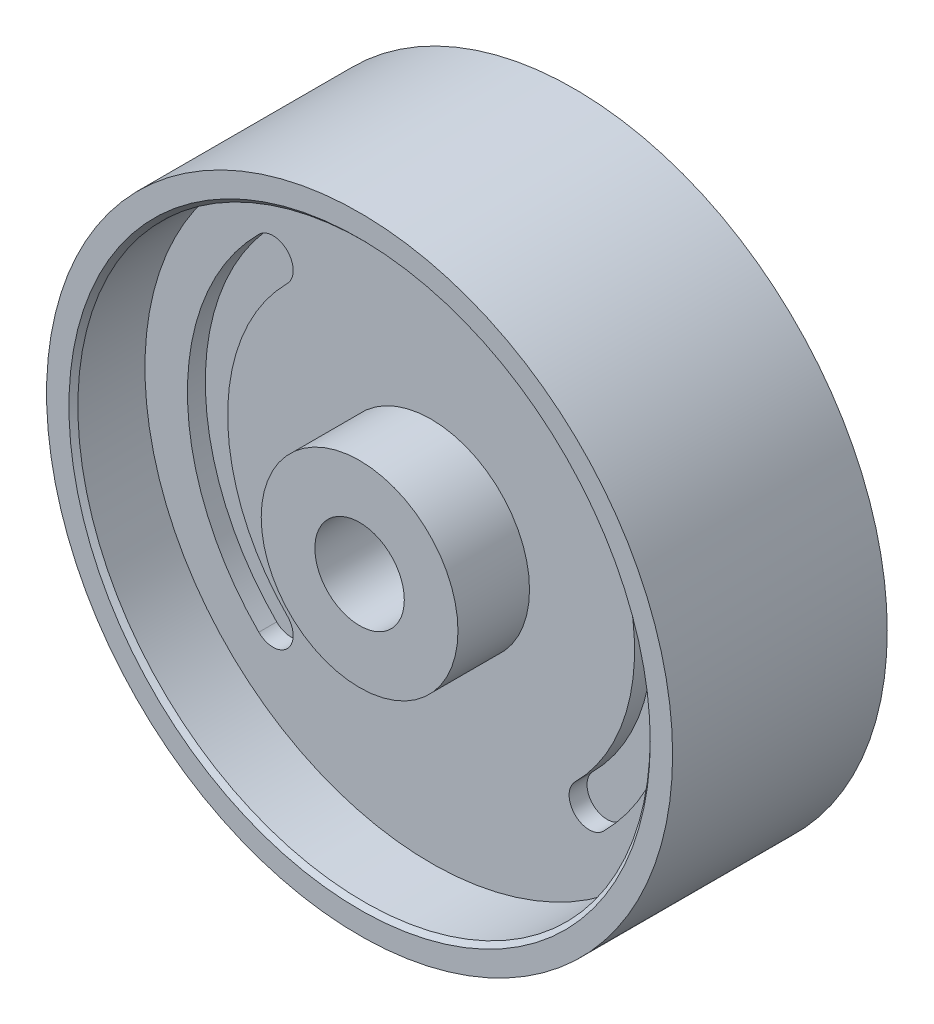
ISO-10303-21;
HEADER;
FILE_DESCRIPTION(('STEP AP214'),'2;1');
FILE_NAME('part.step','',(''),(''),'','','');
FILE_SCHEMA(('AUTOMOTIVE_DESIGN { 1 0 10303 214 1 1 1 1 }'));
ENDSEC;
DATA;
#1=APPLICATION_CONTEXT('core data for automotive mechanical design processes');
#2=APPLICATION_PROTOCOL_DEFINITION('international standard','automotive_design',2000,#1);
#3=PRODUCT_CONTEXT('',#1,'mechanical');
#4=PRODUCT('Part','Part','',(#3));
#5=PRODUCT_RELATED_PRODUCT_CATEGORY('part','',(#4));
#6=PRODUCT_DEFINITION_FORMATION('','',#4);
#7=PRODUCT_DEFINITION_CONTEXT('part definition',#1,'design');
#8=PRODUCT_DEFINITION('design','',#6,#7);
#9=PRODUCT_DEFINITION_SHAPE('','',#8);
#10=(LENGTH_UNIT() NAMED_UNIT(*) SI_UNIT(.MILLI.,.METRE.));
#11=(NAMED_UNIT(*) PLANE_ANGLE_UNIT() SI_UNIT($,.RADIAN.));
#12=(NAMED_UNIT(*) SI_UNIT($,.STERADIAN.) SOLID_ANGLE_UNIT());
#13=UNCERTAINTY_MEASURE_WITH_UNIT(LENGTH_MEASURE(1.E-05),#10,'distance_accuracy_value','');
#14=(GEOMETRIC_REPRESENTATION_CONTEXT(3) GLOBAL_UNCERTAINTY_ASSIGNED_CONTEXT((#13)) GLOBAL_UNIT_ASSIGNED_CONTEXT((#10,
#11,#12)) REPRESENTATION_CONTEXT('',''));
#15=CARTESIAN_POINT('',(0.,0.,0.));
#16=DIRECTION('',(0.,0.,1.));
#17=DIRECTION('',(1.,0.,0.));
#18=AXIS2_PLACEMENT_3D('',#15,#16,#17);
#19=CARTESIAN_POINT('',(0.,0.,-12.));
#20=DIRECTION('',(0.,0.,1.));
#21=DIRECTION('',(1.,0.,0.));
#22=AXIS2_PLACEMENT_3D('',#19,#20,#21);
#23=PLANE('',#22);
#24=CARTESIAN_POINT('',(0.,0.,-12.));
#25=DIRECTION('',(0.,0.,1.));
#26=DIRECTION('',(1.,0.,0.));
#27=AXIS2_PLACEMENT_3D('',#24,#25,#26);
#28=CIRCLE('',#27,5.);
#29=CARTESIAN_POINT('',(5.,0.,-12.));
#30=VERTEX_POINT('',#29);
#31=EDGE_CURVE('E300',#30,#30,#28,.T.);
#32=ORIENTED_EDGE('',*,*,#31,.T.);
#33=EDGE_LOOP('',(#32));
#34=FACE_BOUND('',#33,.T.);
#35=CARTESIAN_POINT('',(0.,0.,-12.));
#36=DIRECTION('',(0.,0.,1.));
#37=DIRECTION('',(1.,0.,0.));
#38=AXIS2_PLACEMENT_3D('',#35,#36,#37);
#39=CIRCLE('',#38,11.);
#40=CARTESIAN_POINT('',(11.,0.,-12.));
#41=VERTEX_POINT('',#40);
#42=EDGE_CURVE('E189',#41,#41,#39,.T.);
#43=ORIENTED_EDGE('',*,*,#42,.F.);
#44=EDGE_LOOP('',(#43));
#45=FACE_BOUND('',#44,.T.);
#46=ADVANCED_FACE('F38',(#34,#45),#23,.F.);
#47=CARTESIAN_POINT('',(0.,0.,4.));
#48=DIRECTION('',(0.,0.,1.));
#49=DIRECTION('',(1.,0.,0.));
#50=AXIS2_PLACEMENT_3D('',#47,#48,#49);
#51=PLANE('',#50);
#52=CARTESIAN_POINT('',(17.6776695296637,17.6776695296637,4.));
#53=DIRECTION('',(0.,0.,1.));
#54=DIRECTION('',(-1.,0.,0.));
#55=AXIS2_PLACEMENT_3D('',#52,#53,#54);
#56=CIRCLE('',#55,2.25);
#57=CARTESIAN_POINT('',(19.2686597873334,19.2686597873335,4.));
#58=VERTEX_POINT('',#57);
#59=CARTESIAN_POINT('',(16.0866792719939,16.086679271994,4.));
#60=VERTEX_POINT('',#59);
#61=EDGE_CURVE('E227',#58,#60,#56,.T.);
#62=ORIENTED_EDGE('',*,*,#61,.F.);
#63=CARTESIAN_POINT('',(0.,0.,4.));
#64=DIRECTION('',(0.,0.,1.));
#65=DIRECTION('',(-1.,0.,0.));
#66=AXIS2_PLACEMENT_3D('',#63,#64,#65);
#67=CIRCLE('',#66,27.25);
#68=CARTESIAN_POINT('',(19.2686597873334,-19.2686597873334,4.));
#69=VERTEX_POINT('',#68);
#70=EDGE_CURVE('E266',#69,#58,#67,.T.);
#71=ORIENTED_EDGE('',*,*,#70,.F.);
#72=CARTESIAN_POINT('',(17.6776695296637,-17.6776695296637,4.));
#73=DIRECTION('',(0.,0.,1.));
#74=DIRECTION('',(-1.,0.,0.));
#75=AXIS2_PLACEMENT_3D('',#72,#73,#74);
#76=CIRCLE('',#75,2.25);
#77=CARTESIAN_POINT('',(16.0866792719939,-16.086679271994,4.));
#78=VERTEX_POINT('',#77);
#79=EDGE_CURVE('E280',#78,#69,#76,.T.);
#80=ORIENTED_EDGE('',*,*,#79,.F.);
#81=CARTESIAN_POINT('',(0.,0.,4.));
#82=DIRECTION('',(0.,0.,-1.));
#83=DIRECTION('',(-1.,0.,0.));
#84=AXIS2_PLACEMENT_3D('',#81,#82,#83);
#85=CIRCLE('',#84,22.75);
#86=EDGE_CURVE('E277',#60,#78,#85,.T.);
#87=ORIENTED_EDGE('',*,*,#86,.F.);
#88=EDGE_LOOP('',(#62,#71,#80,#87));
#89=FACE_BOUND('',#88,.T.);
#90=CARTESIAN_POINT('',(0.,0.,4.));
#91=DIRECTION('',(0.,0.,1.));
#92=DIRECTION('',(1.,0.,0.));
#93=AXIS2_PLACEMENT_3D('',#90,#91,#92);
#94=CIRCLE('',#93,11.);
#95=CARTESIAN_POINT('',(11.,0.,4.));
#96=VERTEX_POINT('',#95);
#97=EDGE_CURVE('E292',#96,#96,#94,.T.);
#98=ORIENTED_EDGE('',*,*,#97,.F.);
#99=EDGE_LOOP('',(#98));
#100=FACE_BOUND('',#99,.T.);
#101=CARTESIAN_POINT('',(0.,0.,4.));
#102=DIRECTION('',(0.,0.,1.));
#103=DIRECTION('',(1.,0.,0.));
#104=AXIS2_PLACEMENT_3D('',#101,#102,#103);
#105=CIRCLE('',#104,32.);
#106=CARTESIAN_POINT('',(32.,0.,4.));
#107=VERTEX_POINT('',#106);
#108=EDGE_CURVE('E295',#107,#107,#105,.T.);
#109=ORIENTED_EDGE('',*,*,#108,.T.);
#110=EDGE_LOOP('',(#109));
#111=FACE_BOUND('',#110,.T.);
#112=CARTESIAN_POINT('',(-17.6776695296637,17.6776695296637,4.));
#113=DIRECTION('',(0.,0.,1.));
#114=DIRECTION('',(1.,0.,0.));
#115=AXIS2_PLACEMENT_3D('',#112,#113,#114);
#116=CIRCLE('',#115,2.25);
#117=CARTESIAN_POINT('',(-16.0866792719939,16.086679271994,4.));
#118=VERTEX_POINT('',#117);
#119=CARTESIAN_POINT('',(-19.2686597873334,19.2686597873335,4.));
#120=VERTEX_POINT('',#119);
#121=EDGE_CURVE('E242',#118,#120,#116,.T.);
#122=ORIENTED_EDGE('',*,*,#121,.F.);
#123=CARTESIAN_POINT('',(0.,0.,4.));
#124=DIRECTION('',(0.,0.,-1.));
#125=DIRECTION('',(1.,0.,0.));
#126=AXIS2_PLACEMENT_3D('',#123,#124,#125);
#127=CIRCLE('',#126,22.75);
#128=CARTESIAN_POINT('',(-16.0866792719939,-16.086679271994,4.));
#129=VERTEX_POINT('',#128);
#130=EDGE_CURVE('E232',#129,#118,#127,.T.);
#131=ORIENTED_EDGE('',*,*,#130,.F.);
#132=CARTESIAN_POINT('',(-17.6776695296637,-17.6776695296637,4.));
#133=DIRECTION('',(0.,0.,1.));
#134=DIRECTION('',(1.,0.,0.));
#135=AXIS2_PLACEMENT_3D('',#132,#133,#134);
#136=CIRCLE('',#135,2.25);
#137=CARTESIAN_POINT('',(-19.2686597873334,-19.2686597873334,4.));
#138=VERTEX_POINT('',#137);
#139=EDGE_CURVE('E249',#138,#129,#136,.T.);
#140=ORIENTED_EDGE('',*,*,#139,.F.);
#141=CARTESIAN_POINT('',(0.,0.,4.));
#142=DIRECTION('',(0.,0.,1.));
#143=DIRECTION('',(1.,0.,0.));
#144=AXIS2_PLACEMENT_3D('',#141,#142,#143);
#145=CIRCLE('',#144,27.25);
#146=EDGE_CURVE('E245',#120,#138,#145,.T.);
#147=ORIENTED_EDGE('',*,*,#146,.F.);
#148=EDGE_LOOP('',(#122,#131,#140,#147));
#149=FACE_BOUND('',#148,.T.);
#150=ADVANCED_FACE('F332',(#89,#100,#111,#149),#51,.T.);
#151=CARTESIAN_POINT('',(0.,0.,12.));
#152=DIRECTION('',(0.,0.,1.));
#153=DIRECTION('',(1.,0.,0.));
#154=AXIS2_PLACEMENT_3D('',#151,#152,#153);
#155=PLANE('',#154);
#156=CARTESIAN_POINT('',(0.,0.,12.));
#157=DIRECTION('',(0.,0.,1.));
#158=DIRECTION('',(1.,0.,0.));
#159=AXIS2_PLACEMENT_3D('',#156,#157,#158);
#160=CIRCLE('',#159,5.);
#161=CARTESIAN_POINT('',(5.,0.,12.));
#162=VERTEX_POINT('',#161);
#163=EDGE_CURVE('E303',#162,#162,#160,.T.);
#164=ORIENTED_EDGE('',*,*,#163,.F.);
#165=EDGE_LOOP('',(#164));
#166=FACE_BOUND('',#165,.T.);
#167=CARTESIAN_POINT('',(0.,0.,12.));
#168=DIRECTION('',(0.,0.,1.));
#169=DIRECTION('',(1.,0.,0.));
#170=AXIS2_PLACEMENT_3D('',#167,#168,#169);
#171=CIRCLE('',#170,11.);
#172=CARTESIAN_POINT('',(11.,0.,12.));
#173=VERTEX_POINT('',#172);
#174=EDGE_CURVE('E255',#173,#173,#171,.T.);
#175=ORIENTED_EDGE('',*,*,#174,.T.);
#176=EDGE_LOOP('',(#175));
#177=FACE_BOUND('',#176,.T.);
#178=ADVANCED_FACE('F338',(#166,#177),#155,.T.);
#179=CARTESIAN_POINT('',(0.,0.,12.));
#180=DIRECTION('',(0.,0.,-1.));
#181=DIRECTION('',(-1.,0.,0.));
#182=AXIS2_PLACEMENT_3D('',#179,#180,#181);
#183=CYLINDRICAL_SURFACE('',#182,35.);
#184=CARTESIAN_POINT('',(0.,0.,12.));
#185=DIRECTION('',(0.,0.,1.));
#186=DIRECTION('',(1.,0.,0.));
#187=AXIS2_PLACEMENT_3D('',#184,#185,#186);
#188=CIRCLE('',#187,35.);
#189=CARTESIAN_POINT('',(35.,0.,12.));
#190=VERTEX_POINT('',#189);
#191=EDGE_CURVE('E307',#190,#190,#188,.T.);
#192=ORIENTED_EDGE('',*,*,#191,.F.);
#193=EDGE_LOOP('',(#192));
#194=FACE_BOUND('',#193,.T.);
#195=CARTESIAN_POINT('',(0.,0.,-12.));
#196=DIRECTION('',(0.,0.,1.));
#197=DIRECTION('',(1.,0.,0.));
#198=AXIS2_PLACEMENT_3D('',#195,#196,#197);
#199=CIRCLE('',#198,35.);
#200=CARTESIAN_POINT('',(35.,0.,-12.));
#201=VERTEX_POINT('',#200);
#202=EDGE_CURVE('E306',#201,#201,#199,.T.);
#203=ORIENTED_EDGE('',*,*,#202,.T.);
#204=EDGE_LOOP('',(#203));
#205=FACE_BOUND('',#204,.T.);
#206=ADVANCED_FACE('F354',(#194,#205),#183,.T.);
#207=CARTESIAN_POINT('',(0.,0.,12.));
#208=DIRECTION('',(0.,0.,1.));
#209=DIRECTION('',(1.,0.,0.));
#210=AXIS2_PLACEMENT_3D('',#207,#208,#209);
#211=CIRCLE('',#210,32.5);
#212=CARTESIAN_POINT('',(32.5,0.,12.));
#213=VERTEX_POINT('',#212);
#214=EDGE_CURVE('E315',#213,#213,#211,.F.);
#215=ORIENTED_EDGE('',*,*,#214,.T.);
#216=EDGE_LOOP('',(#215));
#217=FACE_BOUND('',#216,.T.);
#218=ORIENTED_EDGE('',*,*,#191,.T.);
#219=EDGE_LOOP('',(#218));
#220=FACE_BOUND('',#219,.T.);
#221=ADVANCED_FACE('F346',(#217,#220),#155,.T.);
#222=CARTESIAN_POINT('',(0.,0.,-12.));
#223=DIRECTION('',(0.,0.,1.));
#224=DIRECTION('',(1.,0.,0.));
#225=AXIS2_PLACEMENT_3D('',#222,#223,#224);
#226=CIRCLE('',#225,32.5);
#227=CARTESIAN_POINT('',(32.5,0.,-12.));
#228=VERTEX_POINT('',#227);
#229=EDGE_CURVE('E46',#228,#228,#226,.T.);
#230=ORIENTED_EDGE('',*,*,#229,.T.);
#231=EDGE_LOOP('',(#230));
#232=FACE_BOUND('',#231,.T.);
#233=ORIENTED_EDGE('',*,*,#202,.F.);
#234=EDGE_LOOP('',(#233));
#235=FACE_BOUND('',#234,.T.);
#236=ADVANCED_FACE('F320',(#232,#235),#23,.F.);
#237=CARTESIAN_POINT('',(0.,0.,12.));
#238=DIRECTION('',(0.,0.,-1.));
#239=DIRECTION('',(-1.,0.,0.));
#240=AXIS2_PLACEMENT_3D('',#237,#238,#239);
#241=CYLINDRICAL_SURFACE('',#240,5.);
#242=ORIENTED_EDGE('',*,*,#163,.T.);
#243=EDGE_LOOP('',(#242));
#244=FACE_BOUND('',#243,.T.);
#245=ORIENTED_EDGE('',*,*,#31,.F.);
#246=EDGE_LOOP('',(#245));
#247=FACE_BOUND('',#246,.T.);
#248=ADVANCED_FACE('F345',(#244,#247),#241,.F.);
#249=CARTESIAN_POINT('',(0.,0.,4.));
#250=DIRECTION('',(0.,0.,1.));
#251=DIRECTION('',(1.,0.,0.));
#252=AXIS2_PLACEMENT_3D('',#249,#250,#251);
#253=CYLINDRICAL_SURFACE('',#252,32.);
#254=CARTESIAN_POINT('',(0.,0.,11.5));
#255=DIRECTION('',(0.,0.,1.));
#256=DIRECTION('',(1.,0.,0.));
#257=AXIS2_PLACEMENT_3D('',#254,#255,#256);
#258=CIRCLE('',#257,32.);
#259=CARTESIAN_POINT('',(32.,0.,11.5));
#260=VERTEX_POINT('',#259);
#261=EDGE_CURVE('E310',#260,#260,#258,.T.);
#262=ORIENTED_EDGE('',*,*,#261,.T.);
#263=EDGE_LOOP('',(#262));
#264=FACE_BOUND('',#263,.T.);
#265=ORIENTED_EDGE('',*,*,#108,.F.);
#266=EDGE_LOOP('',(#265));
#267=FACE_BOUND('',#266,.T.);
#268=ADVANCED_FACE('F351',(#264,#267),#253,.F.);
#269=CARTESIAN_POINT('',(0.,0.,4.));
#270=DIRECTION('',(0.,0.,1.));
#271=DIRECTION('',(1.,0.,0.));
#272=AXIS2_PLACEMENT_3D('',#269,#270,#271);
#273=CYLINDRICAL_SURFACE('',#272,11.);
#274=ORIENTED_EDGE('',*,*,#97,.T.);
#275=EDGE_LOOP('',(#274));
#276=FACE_BOUND('',#275,.T.);
#277=ORIENTED_EDGE('',*,*,#174,.F.);
#278=EDGE_LOOP('',(#277));
#279=FACE_BOUND('',#278,.T.);
#280=ADVANCED_FACE('F369',(#276,#279),#273,.T.);
#281=CARTESIAN_POINT('',(17.6776695296637,17.6776695296637,2.));
#282=DIRECTION('',(0.,0.,1.));
#283=DIRECTION('',(1.,0.,0.));
#284=AXIS2_PLACEMENT_3D('',#281,#282,#283);
#285=CYLINDRICAL_SURFACE('',#284,2.25);
#286=ORIENTED_EDGE('',*,*,#61,.T.);
#287=DIRECTION('',(0.,0.,1.));
#288=VECTOR('',#287,1.);
#289=CARTESIAN_POINT('',(16.0866792719939,16.086679271994,2.));
#290=LINE('',#289,#288);
#291=CARTESIAN_POINT('',(16.0866792719939,16.086679271994,2.));
#292=VERTEX_POINT('',#291);
#293=EDGE_CURVE('E275',#292,#60,#290,.T.);
#294=ORIENTED_EDGE('',*,*,#293,.F.);
#295=CARTESIAN_POINT('',(17.6776695296637,17.6776695296637,2.));
#296=DIRECTION('',(0.,0.,1.));
#297=DIRECTION('',(-1.,0.,0.));
#298=AXIS2_PLACEMENT_3D('',#295,#296,#297);
#299=CIRCLE('',#298,2.25);
#300=CARTESIAN_POINT('',(19.2686597873334,19.2686597873335,2.));
#301=VERTEX_POINT('',#300);
#302=EDGE_CURVE('E262',#301,#292,#299,.T.);
#303=ORIENTED_EDGE('',*,*,#302,.F.);
#304=DIRECTION('',(0.,0.,1.));
#305=VECTOR('',#304,1.);
#306=CARTESIAN_POINT('',(19.2686597873334,19.2686597873335,2.));
#307=LINE('',#306,#305);
#308=EDGE_CURVE('E246',#301,#58,#307,.T.);
#309=ORIENTED_EDGE('',*,*,#308,.T.);
#310=EDGE_LOOP('',(#286,#294,#303,#309));
#311=FACE_BOUND('',#310,.T.);
#312=ADVANCED_FACE('F371',(#311),#285,.F.);
#313=CARTESIAN_POINT('',(0.,0.,2.));
#314=DIRECTION('',(0.,0.,1.));
#315=DIRECTION('',(1.,0.,0.));
#316=AXIS2_PLACEMENT_3D('',#313,#314,#315);
#317=CYLINDRICAL_SURFACE('',#316,27.25);
#318=ORIENTED_EDGE('',*,*,#70,.T.);
#319=ORIENTED_EDGE('',*,*,#308,.F.);
#320=CARTESIAN_POINT('',(0.,0.,2.));
#321=DIRECTION('',(0.,0.,1.));
#322=DIRECTION('',(-1.,0.,0.));
#323=AXIS2_PLACEMENT_3D('',#320,#321,#322);
#324=CIRCLE('',#323,27.25);
#325=CARTESIAN_POINT('',(19.2686597873334,-19.2686597873334,2.));
#326=VERTEX_POINT('',#325);
#327=EDGE_CURVE('E272',#326,#301,#324,.T.);
#328=ORIENTED_EDGE('',*,*,#327,.F.);
#329=DIRECTION('',(0.,0.,1.));
#330=VECTOR('',#329,1.);
#331=CARTESIAN_POINT('',(19.2686597873334,-19.2686597873334,2.));
#332=LINE('',#331,#330);
#333=EDGE_CURVE('E286',#326,#69,#332,.T.);
#334=ORIENTED_EDGE('',*,*,#333,.T.);
#335=EDGE_LOOP('',(#318,#319,#328,#334));
#336=FACE_BOUND('',#335,.T.);
#337=ADVANCED_FACE('F378',(#336),#317,.F.);
#338=CARTESIAN_POINT('',(17.6776695296637,-17.6776695296637,2.));
#339=DIRECTION('',(0.,0.,1.));
#340=DIRECTION('',(1.,0.,0.));
#341=AXIS2_PLACEMENT_3D('',#338,#339,#340);
#342=CYLINDRICAL_SURFACE('',#341,2.25);
#343=ORIENTED_EDGE('',*,*,#79,.T.);
#344=ORIENTED_EDGE('',*,*,#333,.F.);
#345=CARTESIAN_POINT('',(17.6776695296637,-17.6776695296637,2.));
#346=DIRECTION('',(0.,0.,1.));
#347=DIRECTION('',(-1.,0.,0.));
#348=AXIS2_PLACEMENT_3D('',#345,#346,#347);
#349=CIRCLE('',#348,2.25);
#350=CARTESIAN_POINT('',(16.0866792719939,-16.086679271994,2.));
#351=VERTEX_POINT('',#350);
#352=EDGE_CURVE('E269',#351,#326,#349,.T.);
#353=ORIENTED_EDGE('',*,*,#352,.F.);
#354=DIRECTION('',(0.,0.,1.));
#355=VECTOR('',#354,1.);
#356=CARTESIAN_POINT('',(16.0866792719939,-16.086679271994,2.));
#357=LINE('',#356,#355);
#358=EDGE_CURVE('E288',#351,#78,#357,.T.);
#359=ORIENTED_EDGE('',*,*,#358,.T.);
#360=EDGE_LOOP('',(#343,#344,#353,#359));
#361=FACE_BOUND('',#360,.T.);
#362=ADVANCED_FACE('F388',(#361),#342,.F.);
#363=CARTESIAN_POINT('',(0.,0.,2.));
#364=DIRECTION('',(0.,0.,1.));
#365=DIRECTION('',(1.,0.,0.));
#366=AXIS2_PLACEMENT_3D('',#363,#364,#365);
#367=CYLINDRICAL_SURFACE('',#366,22.75);
#368=ORIENTED_EDGE('',*,*,#86,.T.);
#369=ORIENTED_EDGE('',*,*,#358,.F.);
#370=CARTESIAN_POINT('',(0.,0.,2.));
#371=DIRECTION('',(0.,0.,-1.));
#372=DIRECTION('',(-1.,0.,0.));
#373=AXIS2_PLACEMENT_3D('',#370,#371,#372);
#374=CIRCLE('',#373,22.75);
#375=EDGE_CURVE('E265',#292,#351,#374,.T.);
#376=ORIENTED_EDGE('',*,*,#375,.F.);
#377=ORIENTED_EDGE('',*,*,#293,.T.);
#378=EDGE_LOOP('',(#368,#369,#376,#377));
#379=FACE_BOUND('',#378,.T.);
#380=ADVANCED_FACE('F384',(#379),#367,.T.);
#381=CARTESIAN_POINT('',(8.83883476483183,8.83883476483186,2.));
#382=DIRECTION('',(0.,0.,-1.));
#383=DIRECTION('',(-1.,0.,0.));
#384=AXIS2_PLACEMENT_3D('',#381,#382,#383);
#385=PLANE('',#384);
#386=ORIENTED_EDGE('',*,*,#302,.T.);
#387=ORIENTED_EDGE('',*,*,#375,.T.);
#388=ORIENTED_EDGE('',*,*,#352,.T.);
#389=ORIENTED_EDGE('',*,*,#327,.T.);
#390=EDGE_LOOP('',(#386,#387,#388,#389));
#391=FACE_BOUND('',#390,.T.);
#392=ADVANCED_FACE('F387',(#391),#385,.F.);
#393=CARTESIAN_POINT('',(-17.6776695296637,17.6776695296637,2.));
#394=DIRECTION('',(0.,0.,1.));
#395=DIRECTION('',(1.,0.,0.));
#396=AXIS2_PLACEMENT_3D('',#393,#394,#395);
#397=CYLINDRICAL_SURFACE('',#396,2.25);
#398=ORIENTED_EDGE('',*,*,#121,.T.);
#399=DIRECTION('',(0.,0.,1.));
#400=VECTOR('',#399,1.);
#401=CARTESIAN_POINT('',(-19.2686597873334,19.2686597873335,2.));
#402=LINE('',#401,#400);
#403=CARTESIAN_POINT('',(-19.2686597873334,19.2686597873335,2.));
#404=VERTEX_POINT('',#403);
#405=EDGE_CURVE('E241',#404,#120,#402,.T.);
#406=ORIENTED_EDGE('',*,*,#405,.F.);
#407=CARTESIAN_POINT('',(-17.6776695296637,17.6776695296637,2.));
#408=DIRECTION('',(0.,0.,1.));
#409=DIRECTION('',(1.,0.,0.));
#410=AXIS2_PLACEMENT_3D('',#407,#408,#409);
#411=CIRCLE('',#410,2.25);
#412=CARTESIAN_POINT('',(-16.0866792719939,16.086679271994,2.));
#413=VERTEX_POINT('',#412);
#414=EDGE_CURVE('E228',#413,#404,#411,.T.);
#415=ORIENTED_EDGE('',*,*,#414,.F.);
#416=DIRECTION('',(0.,0.,1.));
#417=VECTOR('',#416,1.);
#418=CARTESIAN_POINT('',(-16.0866792719939,16.086679271994,2.));
#419=LINE('',#418,#417);
#420=EDGE_CURVE('E253',#413,#118,#419,.T.);
#421=ORIENTED_EDGE('',*,*,#420,.T.);
#422=EDGE_LOOP('',(#398,#406,#415,#421));
#423=FACE_BOUND('',#422,.T.);
#424=ADVANCED_FACE('F398',(#423),#397,.F.);
#425=CARTESIAN_POINT('',(0.,0.,2.));
#426=DIRECTION('',(0.,0.,1.));
#427=DIRECTION('',(1.,0.,0.));
#428=AXIS2_PLACEMENT_3D('',#425,#426,#427);
#429=CYLINDRICAL_SURFACE('',#428,22.75);
#430=ORIENTED_EDGE('',*,*,#130,.T.);
#431=ORIENTED_EDGE('',*,*,#420,.F.);
#432=CARTESIAN_POINT('',(0.,0.,2.));
#433=DIRECTION('',(0.,0.,-1.));
#434=DIRECTION('',(1.,0.,0.));
#435=AXIS2_PLACEMENT_3D('',#432,#433,#434);
#436=CIRCLE('',#435,22.75);
#437=CARTESIAN_POINT('',(-16.0866792719939,-16.086679271994,2.));
#438=VERTEX_POINT('',#437);
#439=EDGE_CURVE('E238',#438,#413,#436,.T.);
#440=ORIENTED_EDGE('',*,*,#439,.F.);
#441=DIRECTION('',(0.,0.,1.));
#442=VECTOR('',#441,1.);
#443=CARTESIAN_POINT('',(-16.0866792719939,-16.086679271994,2.));
#444=LINE('',#443,#442);
#445=EDGE_CURVE('E256',#438,#129,#444,.T.);
#446=ORIENTED_EDGE('',*,*,#445,.T.);
#447=EDGE_LOOP('',(#430,#431,#440,#446));
#448=FACE_BOUND('',#447,.T.);
#449=ADVANCED_FACE('F402',(#448),#429,.T.);
#450=CARTESIAN_POINT('',(-17.6776695296637,-17.6776695296637,2.));
#451=DIRECTION('',(0.,0.,1.));
#452=DIRECTION('',(1.,0.,0.));
#453=AXIS2_PLACEMENT_3D('',#450,#451,#452);
#454=CYLINDRICAL_SURFACE('',#453,2.25);
#455=ORIENTED_EDGE('',*,*,#139,.T.);
#456=ORIENTED_EDGE('',*,*,#445,.F.);
#457=CARTESIAN_POINT('',(-17.6776695296637,-17.6776695296637,2.));
#458=DIRECTION('',(0.,0.,1.));
#459=DIRECTION('',(1.,0.,0.));
#460=AXIS2_PLACEMENT_3D('',#457,#458,#459);
#461=CIRCLE('',#460,2.25);
#462=CARTESIAN_POINT('',(-19.2686597873334,-19.2686597873334,2.));
#463=VERTEX_POINT('',#462);
#464=EDGE_CURVE('E235',#463,#438,#461,.T.);
#465=ORIENTED_EDGE('',*,*,#464,.F.);
#466=DIRECTION('',(0.,0.,1.));
#467=VECTOR('',#466,1.);
#468=CARTESIAN_POINT('',(-19.2686597873334,-19.2686597873334,2.));
#469=LINE('',#468,#467);
#470=EDGE_CURVE('E259',#463,#138,#469,.T.);
#471=ORIENTED_EDGE('',*,*,#470,.T.);
#472=EDGE_LOOP('',(#455,#456,#465,#471));
#473=FACE_BOUND('',#472,.T.);
#474=ADVANCED_FACE('F408',(#473),#454,.F.);
#475=CARTESIAN_POINT('',(0.,0.,2.));
#476=DIRECTION('',(0.,0.,1.));
#477=DIRECTION('',(1.,0.,0.));
#478=AXIS2_PLACEMENT_3D('',#475,#476,#477);
#479=CYLINDRICAL_SURFACE('',#478,27.25);
#480=ORIENTED_EDGE('',*,*,#146,.T.);
#481=ORIENTED_EDGE('',*,*,#470,.F.);
#482=CARTESIAN_POINT('',(0.,0.,2.));
#483=DIRECTION('',(0.,0.,1.));
#484=DIRECTION('',(1.,0.,0.));
#485=AXIS2_PLACEMENT_3D('',#482,#483,#484);
#486=CIRCLE('',#485,27.25);
#487=EDGE_CURVE('E231',#404,#463,#486,.T.);
#488=ORIENTED_EDGE('',*,*,#487,.F.);
#489=ORIENTED_EDGE('',*,*,#405,.T.);
#490=EDGE_LOOP('',(#480,#481,#488,#489));
#491=FACE_BOUND('',#490,.T.);
#492=ADVANCED_FACE('F404',(#491),#479,.F.);
#493=CARTESIAN_POINT('',(-8.83883476483183,8.83883476483186,2.));
#494=DIRECTION('',(0.,0.,1.));
#495=DIRECTION('',(1.,0.,0.));
#496=AXIS2_PLACEMENT_3D('',#493,#494,#495);
#497=PLANE('',#496);
#498=ORIENTED_EDGE('',*,*,#414,.T.);
#499=ORIENTED_EDGE('',*,*,#487,.T.);
#500=ORIENTED_EDGE('',*,*,#464,.T.);
#501=ORIENTED_EDGE('',*,*,#439,.T.);
#502=EDGE_LOOP('',(#498,#499,#500,#501));
#503=FACE_BOUND('',#502,.T.);
#504=ADVANCED_FACE('F407',(#503),#497,.T.);
#505=CARTESIAN_POINT('',(0.,0.,-4.));
#506=DIRECTION('',(0.,0.,-1.));
#507=DIRECTION('',(1.,0.,0.));
#508=AXIS2_PLACEMENT_3D('',#505,#506,#507);
#509=PLANE('',#508);
#510=CARTESIAN_POINT('',(0.,0.,-4.));
#511=DIRECTION('',(0.,0.,-1.));
#512=DIRECTION('',(1.,0.,0.));
#513=AXIS2_PLACEMENT_3D('',#510,#511,#512);
#514=CIRCLE('',#513,22.75);
#515=CARTESIAN_POINT('',(-16.0866792719939,-16.086679271994,-4.));
#516=VERTEX_POINT('',#515);
#517=CARTESIAN_POINT('',(-16.0866792719939,16.086679271994,-4.));
#518=VERTEX_POINT('',#517);
#519=EDGE_CURVE('E182',#516,#518,#514,.T.);
#520=ORIENTED_EDGE('',*,*,#519,.T.);
#521=CARTESIAN_POINT('',(-17.6776695296637,17.6776695296637,-4.));
#522=DIRECTION('',(0.,0.,1.));
#523=DIRECTION('',(1.,0.,0.));
#524=AXIS2_PLACEMENT_3D('',#521,#522,#523);
#525=CIRCLE('',#524,2.25);
#526=CARTESIAN_POINT('',(-19.2686597873334,19.2686597873335,-4.));
#527=VERTEX_POINT('',#526);
#528=EDGE_CURVE('E53',#518,#527,#525,.T.);
#529=ORIENTED_EDGE('',*,*,#528,.T.);
#530=CARTESIAN_POINT('',(0.,0.,-4.));
#531=DIRECTION('',(0.,0.,1.));
#532=DIRECTION('',(1.,0.,0.));
#533=AXIS2_PLACEMENT_3D('',#530,#531,#532);
#534=CIRCLE('',#533,27.25);
#535=CARTESIAN_POINT('',(-19.2686597873334,-19.2686597873334,-4.));
#536=VERTEX_POINT('',#535);
#537=EDGE_CURVE('E173',#527,#536,#534,.T.);
#538=ORIENTED_EDGE('',*,*,#537,.T.);
#539=CARTESIAN_POINT('',(-17.6776695296637,-17.6776695296637,-4.));
#540=DIRECTION('',(0.,0.,1.));
#541=DIRECTION('',(1.,0.,0.));
#542=AXIS2_PLACEMENT_3D('',#539,#540,#541);
#543=CIRCLE('',#542,2.25);
#544=EDGE_CURVE('E176',#536,#516,#543,.T.);
#545=ORIENTED_EDGE('',*,*,#544,.T.);
#546=EDGE_LOOP('',(#520,#529,#538,#545));
#547=FACE_BOUND('',#546,.T.);
#548=CARTESIAN_POINT('',(0.,0.,-4.));
#549=DIRECTION('',(0.,0.,1.));
#550=DIRECTION('',(-1.,0.,0.));
#551=AXIS2_PLACEMENT_3D('',#548,#549,#550);
#552=CIRCLE('',#551,27.25);
#553=CARTESIAN_POINT('',(19.2686597873334,-19.2686597873334,-4.));
#554=VERTEX_POINT('',#553);
#555=CARTESIAN_POINT('',(19.2686597873334,19.2686597873335,-4.));
#556=VERTEX_POINT('',#555);
#557=EDGE_CURVE('E205',#554,#556,#552,.T.);
#558=ORIENTED_EDGE('',*,*,#557,.T.);
#559=CARTESIAN_POINT('',(17.6776695296637,17.6776695296637,-4.));
#560=DIRECTION('',(0.,0.,1.));
#561=DIRECTION('',(-1.,0.,0.));
#562=AXIS2_PLACEMENT_3D('',#559,#560,#561);
#563=CIRCLE('',#562,2.25);
#564=CARTESIAN_POINT('',(16.0866792719939,16.086679271994,-4.));
#565=VERTEX_POINT('',#564);
#566=EDGE_CURVE('E61',#556,#565,#563,.T.);
#567=ORIENTED_EDGE('',*,*,#566,.T.);
#568=CARTESIAN_POINT('',(0.,0.,-4.));
#569=DIRECTION('',(0.,0.,-1.));
#570=DIRECTION('',(-1.,0.,0.));
#571=AXIS2_PLACEMENT_3D('',#568,#569,#570);
#572=CIRCLE('',#571,22.75);
#573=CARTESIAN_POINT('',(16.0866792719939,-16.086679271994,-4.));
#574=VERTEX_POINT('',#573);
#575=EDGE_CURVE('E197',#565,#574,#572,.T.);
#576=ORIENTED_EDGE('',*,*,#575,.T.);
#577=CARTESIAN_POINT('',(17.6776695296637,-17.6776695296637,-4.));
#578=DIRECTION('',(0.,0.,1.));
#579=DIRECTION('',(-1.,0.,0.));
#580=AXIS2_PLACEMENT_3D('',#577,#578,#579);
#581=CIRCLE('',#580,2.25);
#582=EDGE_CURVE('E208',#574,#554,#581,.T.);
#583=ORIENTED_EDGE('',*,*,#582,.T.);
#584=EDGE_LOOP('',(#558,#567,#576,#583));
#585=FACE_BOUND('',#584,.T.);
#586=CARTESIAN_POINT('',(0.,0.,-4.));
#587=DIRECTION('',(0.,0.,1.));
#588=DIRECTION('',(1.,0.,0.));
#589=AXIS2_PLACEMENT_3D('',#586,#587,#588);
#590=CIRCLE('',#589,32.);
#591=CARTESIAN_POINT('',(32.,0.,-4.));
#592=VERTEX_POINT('',#591);
#593=EDGE_CURVE('E222',#592,#592,#590,.T.);
#594=ORIENTED_EDGE('',*,*,#593,.F.);
#595=EDGE_LOOP('',(#594));
#596=FACE_BOUND('',#595,.T.);
#597=CARTESIAN_POINT('',(0.,0.,-4.));
#598=DIRECTION('',(0.,0.,1.));
#599=DIRECTION('',(1.,0.,0.));
#600=AXIS2_PLACEMENT_3D('',#597,#598,#599);
#601=CIRCLE('',#600,11.);
#602=CARTESIAN_POINT('',(11.,0.,-4.));
#603=VERTEX_POINT('',#602);
#604=EDGE_CURVE('E219',#603,#603,#601,.T.);
#605=ORIENTED_EDGE('',*,*,#604,.T.);
#606=EDGE_LOOP('',(#605));
#607=FACE_BOUND('',#606,.T.);
#608=ADVANCED_FACE('F418',(#547,#585,#596,#607),#509,.T.);
#609=CARTESIAN_POINT('',(0.,0.,-4.));
#610=DIRECTION('',(0.,0.,-1.));
#611=DIRECTION('',(-1.,0.,0.));
#612=AXIS2_PLACEMENT_3D('',#609,#610,#611);
#613=CYLINDRICAL_SURFACE('',#612,32.);
#614=CARTESIAN_POINT('',(0.,0.,-11.5));
#615=DIRECTION('',(0.,0.,1.));
#616=DIRECTION('',(1.,0.,0.));
#617=AXIS2_PLACEMENT_3D('',#614,#615,#616);
#618=CIRCLE('',#617,32.);
#619=CARTESIAN_POINT('',(32.,0.,-11.5));
#620=VERTEX_POINT('',#619);
#621=EDGE_CURVE('E11',#620,#620,#618,.F.);
#622=ORIENTED_EDGE('',*,*,#621,.T.);
#623=EDGE_LOOP('',(#622));
#624=FACE_BOUND('',#623,.T.);
#625=ORIENTED_EDGE('',*,*,#593,.T.);
#626=EDGE_LOOP('',(#625));
#627=FACE_BOUND('',#626,.T.);
#628=ADVANCED_FACE('F420',(#624,#627),#613,.F.);
#629=CARTESIAN_POINT('',(0.,0.,-4.));
#630=DIRECTION('',(0.,0.,-1.));
#631=DIRECTION('',(-1.,0.,0.));
#632=AXIS2_PLACEMENT_3D('',#629,#630,#631);
#633=CYLINDRICAL_SURFACE('',#632,11.);
#634=ORIENTED_EDGE('',*,*,#604,.F.);
#635=EDGE_LOOP('',(#634));
#636=FACE_BOUND('',#635,.T.);
#637=ORIENTED_EDGE('',*,*,#42,.T.);
#638=EDGE_LOOP('',(#637));
#639=FACE_BOUND('',#638,.T.);
#640=ADVANCED_FACE('F423',(#636,#639),#633,.T.);
#641=CARTESIAN_POINT('',(17.6776695296637,17.6776695296637,-2.));
#642=DIRECTION('',(0.,0.,-1.));
#643=DIRECTION('',(-1.,0.,0.));
#644=AXIS2_PLACEMENT_3D('',#641,#642,#643);
#645=CYLINDRICAL_SURFACE('',#644,2.25);
#646=ORIENTED_EDGE('',*,*,#566,.F.);
#647=DIRECTION('',(0.,0.,-1.));
#648=VECTOR('',#647,1.);
#649=CARTESIAN_POINT('',(19.2686597873334,19.2686597873335,-2.));
#650=LINE('',#649,#648);
#651=CARTESIAN_POINT('',(19.2686597873334,19.2686597873335,-2.));
#652=VERTEX_POINT('',#651);
#653=EDGE_CURVE('E203',#652,#556,#650,.T.);
#654=ORIENTED_EDGE('',*,*,#653,.F.);
#655=CARTESIAN_POINT('',(17.6776695296637,17.6776695296637,-2.));
#656=DIRECTION('',(0.,0.,1.));
#657=DIRECTION('',(-1.,0.,0.));
#658=AXIS2_PLACEMENT_3D('',#655,#656,#657);
#659=CIRCLE('',#658,2.25);
#660=CARTESIAN_POINT('',(16.0866792719939,16.086679271994,-2.));
#661=VERTEX_POINT('',#660);
#662=EDGE_CURVE('E193',#652,#661,#659,.T.);
#663=ORIENTED_EDGE('',*,*,#662,.T.);
#664=DIRECTION('',(0.,0.,-1.));
#665=VECTOR('',#664,1.);
#666=CARTESIAN_POINT('',(16.0866792719939,16.086679271994,-2.));
#667=LINE('',#666,#665);
#668=EDGE_CURVE('E183',#661,#565,#667,.T.);
#669=ORIENTED_EDGE('',*,*,#668,.T.);
#670=EDGE_LOOP('',(#646,#654,#663,#669));
#671=FACE_BOUND('',#670,.T.);
#672=ADVANCED_FACE('F430',(#671),#645,.F.);
#673=CARTESIAN_POINT('',(0.,0.,-2.));
#674=DIRECTION('',(0.,0.,-1.));
#675=DIRECTION('',(-1.,0.,0.));
#676=AXIS2_PLACEMENT_3D('',#673,#674,#675);
#677=CYLINDRICAL_SURFACE('',#676,22.75);
#678=ORIENTED_EDGE('',*,*,#575,.F.);
#679=ORIENTED_EDGE('',*,*,#668,.F.);
#680=CARTESIAN_POINT('',(0.,0.,-2.));
#681=DIRECTION('',(0.,0.,-1.));
#682=DIRECTION('',(-1.,0.,0.));
#683=AXIS2_PLACEMENT_3D('',#680,#681,#682);
#684=CIRCLE('',#683,22.75);
#685=CARTESIAN_POINT('',(16.0866792719939,-16.086679271994,-2.));
#686=VERTEX_POINT('',#685);
#687=EDGE_CURVE('E201',#661,#686,#684,.T.);
#688=ORIENTED_EDGE('',*,*,#687,.T.);
#689=DIRECTION('',(0.,0.,-1.));
#690=VECTOR('',#689,1.);
#691=CARTESIAN_POINT('',(16.0866792719939,-16.086679271994,-2.));
#692=LINE('',#691,#690);
#693=EDGE_CURVE('E214',#686,#574,#692,.T.);
#694=ORIENTED_EDGE('',*,*,#693,.T.);
#695=EDGE_LOOP('',(#678,#679,#688,#694));
#696=FACE_BOUND('',#695,.T.);
#697=ADVANCED_FACE('F434',(#696),#677,.T.);
#698=CARTESIAN_POINT('',(17.6776695296637,-17.6776695296637,-2.));
#699=DIRECTION('',(0.,0.,-1.));
#700=DIRECTION('',(-1.,0.,0.));
#701=AXIS2_PLACEMENT_3D('',#698,#699,#700);
#702=CYLINDRICAL_SURFACE('',#701,2.25);
#703=ORIENTED_EDGE('',*,*,#582,.F.);
#704=ORIENTED_EDGE('',*,*,#693,.F.);
#705=CARTESIAN_POINT('',(17.6776695296637,-17.6776695296637,-2.));
#706=DIRECTION('',(0.,0.,1.));
#707=DIRECTION('',(-1.,0.,0.));
#708=AXIS2_PLACEMENT_3D('',#705,#706,#707);
#709=CIRCLE('',#708,2.25);
#710=CARTESIAN_POINT('',(19.2686597873334,-19.2686597873334,-2.));
#711=VERTEX_POINT('',#710);
#712=EDGE_CURVE('E199',#686,#711,#709,.T.);
#713=ORIENTED_EDGE('',*,*,#712,.T.);
#714=DIRECTION('',(0.,0.,-1.));
#715=VECTOR('',#714,1.);
#716=CARTESIAN_POINT('',(19.2686597873334,-19.2686597873334,-2.));
#717=LINE('',#716,#715);
#718=EDGE_CURVE('E216',#711,#554,#717,.T.);
#719=ORIENTED_EDGE('',*,*,#718,.T.);
#720=EDGE_LOOP('',(#703,#704,#713,#719));
#721=FACE_BOUND('',#720,.T.);
#722=ADVANCED_FACE('F439',(#721),#702,.F.);
#723=CARTESIAN_POINT('',(0.,0.,-2.));
#724=DIRECTION('',(0.,0.,-1.));
#725=DIRECTION('',(-1.,0.,0.));
#726=AXIS2_PLACEMENT_3D('',#723,#724,#725);
#727=CYLINDRICAL_SURFACE('',#726,27.25);
#728=ORIENTED_EDGE('',*,*,#557,.F.);
#729=ORIENTED_EDGE('',*,*,#718,.F.);
#730=CARTESIAN_POINT('',(0.,0.,-2.));
#731=DIRECTION('',(0.,0.,1.));
#732=DIRECTION('',(-1.,0.,0.));
#733=AXIS2_PLACEMENT_3D('',#730,#731,#732);
#734=CIRCLE('',#733,27.25);
#735=EDGE_CURVE('E196',#711,#652,#734,.T.);
#736=ORIENTED_EDGE('',*,*,#735,.T.);
#737=ORIENTED_EDGE('',*,*,#653,.T.);
#738=EDGE_LOOP('',(#728,#729,#736,#737));
#739=FACE_BOUND('',#738,.T.);
#740=ADVANCED_FACE('F435',(#739),#727,.F.);
#741=CARTESIAN_POINT('',(8.83883476483183,8.83883476483186,-2.));
#742=DIRECTION('',(0.,0.,1.));
#743=DIRECTION('',(-1.,0.,0.));
#744=AXIS2_PLACEMENT_3D('',#741,#742,#743);
#745=PLANE('',#744);
#746=ORIENTED_EDGE('',*,*,#662,.F.);
#747=ORIENTED_EDGE('',*,*,#735,.F.);
#748=ORIENTED_EDGE('',*,*,#712,.F.);
#749=ORIENTED_EDGE('',*,*,#687,.F.);
#750=EDGE_LOOP('',(#746,#747,#748,#749));
#751=FACE_BOUND('',#750,.T.);
#752=ADVANCED_FACE('F438',(#751),#745,.F.);
#753=CARTESIAN_POINT('',(-17.6776695296637,17.6776695296637,-2.));
#754=DIRECTION('',(0.,0.,-1.));
#755=DIRECTION('',(-1.,0.,0.));
#756=AXIS2_PLACEMENT_3D('',#753,#754,#755);
#757=CYLINDRICAL_SURFACE('',#756,2.25);
#758=ORIENTED_EDGE('',*,*,#528,.F.);
#759=DIRECTION('',(0.,0.,-1.));
#760=VECTOR('',#759,1.);
#761=CARTESIAN_POINT('',(-16.0866792719939,16.086679271994,-2.));
#762=LINE('',#761,#760);
#763=CARTESIAN_POINT('',(-16.0866792719939,16.086679271994,-2.));
#764=VERTEX_POINT('',#763);
#765=EDGE_CURVE('E158',#764,#518,#762,.T.);
#766=ORIENTED_EDGE('',*,*,#765,.F.);
#767=CARTESIAN_POINT('',(-17.6776695296637,17.6776695296637,-2.));
#768=DIRECTION('',(0.,0.,1.));
#769=DIRECTION('',(1.,0.,0.));
#770=AXIS2_PLACEMENT_3D('',#767,#768,#769);
#771=CIRCLE('',#770,2.25);
#772=CARTESIAN_POINT('',(-19.2686597873334,19.2686597873335,-2.));
#773=VERTEX_POINT('',#772);
#774=EDGE_CURVE('E165',#764,#773,#771,.T.);
#775=ORIENTED_EDGE('',*,*,#774,.T.);
#776=DIRECTION('',(0.,0.,-1.));
#777=VECTOR('',#776,1.);
#778=CARTESIAN_POINT('',(-19.2686597873334,19.2686597873335,-2.));
#779=LINE('',#778,#777);
#780=EDGE_CURVE('E187',#773,#527,#779,.T.);
#781=ORIENTED_EDGE('',*,*,#780,.T.);
#782=EDGE_LOOP('',(#758,#766,#775,#781));
#783=FACE_BOUND('',#782,.T.);
#784=ADVANCED_FACE('F168',(#783),#757,.F.);
#785=CARTESIAN_POINT('',(0.,0.,-2.));
#786=DIRECTION('',(0.,0.,-1.));
#787=DIRECTION('',(-1.,0.,0.));
#788=AXIS2_PLACEMENT_3D('',#785,#786,#787);
#789=CYLINDRICAL_SURFACE('',#788,27.25);
#790=ORIENTED_EDGE('',*,*,#537,.F.);
#791=ORIENTED_EDGE('',*,*,#780,.F.);
#792=CARTESIAN_POINT('',(0.,0.,-2.));
#793=DIRECTION('',(0.,0.,1.));
#794=DIRECTION('',(1.,0.,0.));
#795=AXIS2_PLACEMENT_3D('',#792,#793,#794);
#796=CIRCLE('',#795,27.25);
#797=CARTESIAN_POINT('',(-19.2686597873334,-19.2686597873334,-2.));
#798=VERTEX_POINT('',#797);
#799=EDGE_CURVE('E170',#773,#798,#796,.T.);
#800=ORIENTED_EDGE('',*,*,#799,.T.);
#801=DIRECTION('',(0.,0.,-1.));
#802=VECTOR('',#801,1.);
#803=CARTESIAN_POINT('',(-19.2686597873334,-19.2686597873334,-2.));
#804=LINE('',#803,#802);
#805=EDGE_CURVE('E190',#798,#536,#804,.T.);
#806=ORIENTED_EDGE('',*,*,#805,.T.);
#807=EDGE_LOOP('',(#790,#791,#800,#806));
#808=FACE_BOUND('',#807,.T.);
#809=ADVANCED_FACE('F452',(#808),#789,.F.);
#810=CARTESIAN_POINT('',(-17.6776695296637,-17.6776695296637,-2.));
#811=DIRECTION('',(0.,0.,-1.));
#812=DIRECTION('',(-1.,0.,0.));
#813=AXIS2_PLACEMENT_3D('',#810,#811,#812);
#814=CYLINDRICAL_SURFACE('',#813,2.25);
#815=ORIENTED_EDGE('',*,*,#544,.F.);
#816=ORIENTED_EDGE('',*,*,#805,.F.);
#817=CARTESIAN_POINT('',(-17.6776695296637,-17.6776695296637,-2.));
#818=DIRECTION('',(0.,0.,1.));
#819=DIRECTION('',(1.,0.,0.));
#820=AXIS2_PLACEMENT_3D('',#817,#818,#819);
#821=CIRCLE('',#820,2.25);
#822=CARTESIAN_POINT('',(-16.0866792719939,-16.086679271994,-2.));
#823=VERTEX_POINT('',#822);
#824=EDGE_CURVE('E164',#798,#823,#821,.T.);
#825=ORIENTED_EDGE('',*,*,#824,.T.);
#826=DIRECTION('',(0.,0.,-1.));
#827=VECTOR('',#826,1.);
#828=CARTESIAN_POINT('',(-16.0866792719939,-16.086679271994,-2.));
#829=LINE('',#828,#827);
#830=EDGE_CURVE('E160',#823,#516,#829,.T.);
#831=ORIENTED_EDGE('',*,*,#830,.T.);
#832=EDGE_LOOP('',(#815,#816,#825,#831));
#833=FACE_BOUND('',#832,.T.);
#834=ADVANCED_FACE('F455',(#833),#814,.F.);
#835=CARTESIAN_POINT('',(0.,0.,-2.));
#836=DIRECTION('',(0.,0.,-1.));
#837=DIRECTION('',(-1.,0.,0.));
#838=AXIS2_PLACEMENT_3D('',#835,#836,#837);
#839=CYLINDRICAL_SURFACE('',#838,22.75);
#840=ORIENTED_EDGE('',*,*,#519,.F.);
#841=ORIENTED_EDGE('',*,*,#830,.F.);
#842=CARTESIAN_POINT('',(0.,0.,-2.));
#843=DIRECTION('',(0.,0.,-1.));
#844=DIRECTION('',(1.,0.,0.));
#845=AXIS2_PLACEMENT_3D('',#842,#843,#844);
#846=CIRCLE('',#845,22.75);
#847=EDGE_CURVE('E155',#823,#764,#846,.T.);
#848=ORIENTED_EDGE('',*,*,#847,.T.);
#849=ORIENTED_EDGE('',*,*,#765,.T.);
#850=EDGE_LOOP('',(#840,#841,#848,#849));
#851=FACE_BOUND('',#850,.T.);
#852=ADVANCED_FACE('F157',(#851),#839,.T.);
#853=CARTESIAN_POINT('',(-8.83883476483183,8.83883476483186,-2.));
#854=DIRECTION('',(0.,0.,-1.));
#855=DIRECTION('',(1.,0.,0.));
#856=AXIS2_PLACEMENT_3D('',#853,#854,#855);
#857=PLANE('',#856);
#858=ORIENTED_EDGE('',*,*,#774,.F.);
#859=ORIENTED_EDGE('',*,*,#847,.F.);
#860=ORIENTED_EDGE('',*,*,#824,.F.);
#861=ORIENTED_EDGE('',*,*,#799,.F.);
#862=EDGE_LOOP('',(#858,#859,#860,#861));
#863=FACE_BOUND('',#862,.T.);
#864=ADVANCED_FACE('F172',(#863),#857,.T.);
#865=CARTESIAN_POINT('',(0.,0.,11.5));
#866=DIRECTION('',(0.,0.,1.));
#867=DIRECTION('',(1.,0.,0.));
#868=AXIS2_PLACEMENT_3D('',#865,#866,#867);
#869=CONICAL_SURFACE('',#868,32.,0.785398163397448);
#870=ORIENTED_EDGE('',*,*,#214,.F.);
#871=EDGE_LOOP('',(#870));
#872=FACE_BOUND('',#871,.T.);
#873=ORIENTED_EDGE('',*,*,#261,.F.);
#874=EDGE_LOOP('',(#873));
#875=FACE_BOUND('',#874,.T.);
#876=ADVANCED_FACE('F324',(#872,#875),#869,.F.);
#877=CARTESIAN_POINT('',(0.,0.,-12.));
#878=DIRECTION('',(0.,0.,-1.));
#879=DIRECTION('',(-1.,0.,0.));
#880=AXIS2_PLACEMENT_3D('',#877,#878,#879);
#881=CONICAL_SURFACE('',#880,32.5,0.785398163397448);
#882=ORIENTED_EDGE('',*,*,#621,.F.);
#883=EDGE_LOOP('',(#882));
#884=FACE_BOUND('',#883,.T.);
#885=ORIENTED_EDGE('',*,*,#229,.F.);
#886=EDGE_LOOP('',(#885));
#887=FACE_BOUND('',#886,.T.);
#888=ADVANCED_FACE('F40',(#884,#887),#881,.F.);
#889=CLOSED_SHELL('',(#46,#150,#178,#206,#221,#236,#248,#268,#280,#312,#337,#362,#380,#392,#424,
#449,#474,#492,#504,#608,#628,#640,#672,#697,#722,#740,#752,#784,#809,#834,#852,#864,#876,#888));
#890=MANIFOLD_SOLID_BREP('B2',#889);
#891=ADVANCED_BREP_SHAPE_REPRESENTATION('',(#18,#890),#14);
#892=SHAPE_DEFINITION_REPRESENTATION(#9,#891);
ENDSEC;
END-ISO-10303-21;
